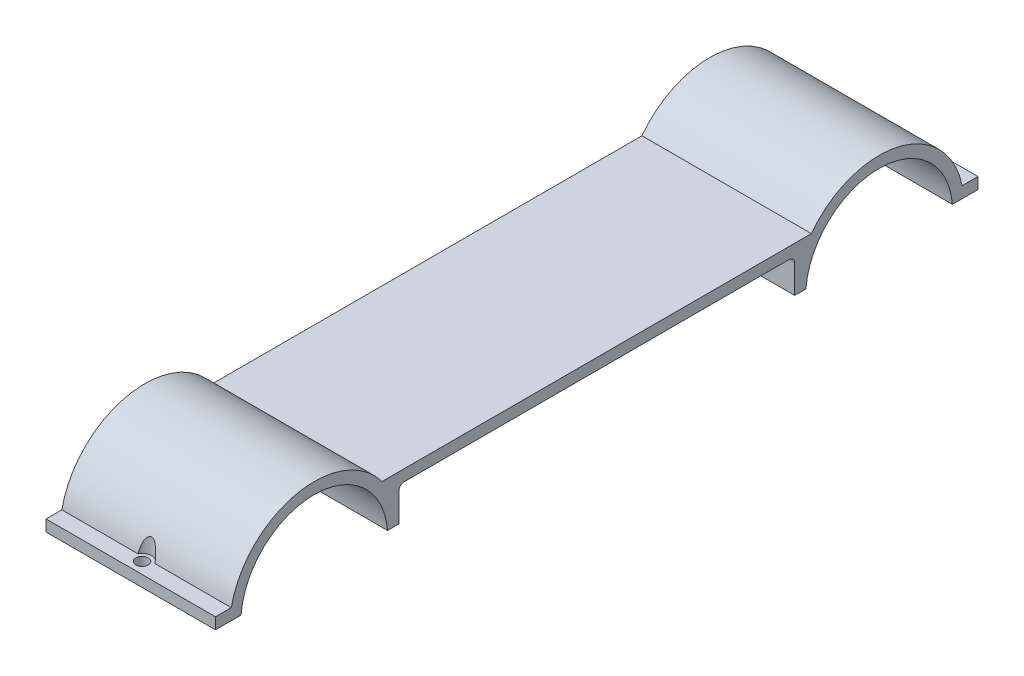
ISO-10303-21;
HEADER;
FILE_DESCRIPTION(('STEP AP214'),'2;1');
FILE_NAME('part.step','',(''),(''),'','','');
FILE_SCHEMA(('AUTOMOTIVE_DESIGN { 1 0 10303 214 1 1 1 1 }'));
ENDSEC;
DATA;
#1=APPLICATION_CONTEXT('core data for automotive mechanical design processes');
#2=APPLICATION_PROTOCOL_DEFINITION('international standard','automotive_design',2000,#1);
#3=PRODUCT_CONTEXT('',#1,'mechanical');
#4=PRODUCT('Part','Part','',(#3));
#5=PRODUCT_RELATED_PRODUCT_CATEGORY('part','',(#4));
#6=PRODUCT_DEFINITION_FORMATION('','',#4);
#7=PRODUCT_DEFINITION_CONTEXT('part definition',#1,'design');
#8=PRODUCT_DEFINITION('design','',#6,#7);
#9=PRODUCT_DEFINITION_SHAPE('','',#8);
#10=(LENGTH_UNIT() NAMED_UNIT(*) SI_UNIT(.MILLI.,.METRE.));
#11=(NAMED_UNIT(*) PLANE_ANGLE_UNIT() SI_UNIT($,.RADIAN.));
#12=(NAMED_UNIT(*) SI_UNIT($,.STERADIAN.) SOLID_ANGLE_UNIT());
#13=UNCERTAINTY_MEASURE_WITH_UNIT(LENGTH_MEASURE(1.E-05),#10,'distance_accuracy_value','');
#14=(GEOMETRIC_REPRESENTATION_CONTEXT(3) GLOBAL_UNCERTAINTY_ASSIGNED_CONTEXT((#13)) GLOBAL_UNIT_ASSIGNED_CONTEXT((#10,
#11,#12)) REPRESENTATION_CONTEXT('',''));
#15=CARTESIAN_POINT('',(0.,0.,0.));
#16=DIRECTION('',(0.,0.,1.));
#17=DIRECTION('',(1.,0.,0.));
#18=AXIS2_PLACEMENT_3D('',#15,#16,#17);
#19=CARTESIAN_POINT('',(0.,13.,65.5));
#20=DIRECTION('',(0.,-1.,0.));
#21=DIRECTION('',(0.,0.,-1.));
#22=AXIS2_PLACEMENT_3D('',#19,#20,#21);
#23=CYLINDRICAL_SURFACE('',#22,1.1);
#24=CARTESIAN_POINT('',(0.,1.,65.5));
#25=DIRECTION('',(0.,-1.,0.));
#26=DIRECTION('',(0.,0.,-1.));
#27=AXIS2_PLACEMENT_3D('',#24,#25,#26);
#28=CIRCLE('',#27,1.1);
#29=CARTESIAN_POINT('',(0.,1.,64.4));
#30=VERTEX_POINT('',#29);
#31=EDGE_CURVE('E251',#30,#30,#28,.T.);
#32=ORIENTED_EDGE('',*,*,#31,.T.);
#33=EDGE_LOOP('',(#32));
#34=FACE_BOUND('',#33,.T.);
#35=CARTESIAN_POINT('',(0.,3.,65.5));
#36=DIRECTION('',(0.,1.,0.));
#37=DIRECTION('',(0.,0.,1.));
#38=AXIS2_PLACEMENT_3D('',#35,#36,#37);
#39=CIRCLE('',#38,1.1);
#40=CARTESIAN_POINT('',(0.,3.,66.6));
#41=VERTEX_POINT('',#40);
#42=EDGE_CURVE('E182',#41,#41,#39,.T.);
#43=ORIENTED_EDGE('',*,*,#42,.T.);
#44=EDGE_LOOP('',(#43));
#45=FACE_BOUND('',#44,.T.);
#46=ADVANCED_FACE('F34',(#34,#45),#23,.F.);
#47=CARTESIAN_POINT('',(-15.,0.,-50.));
#48=DIRECTION('',(1.,0.,0.));
#49=DIRECTION('',(0.,0.,-1.));
#50=AXIS2_PLACEMENT_3D('',#47,#48,#49);
#51=CYLINDRICAL_SURFACE('',#50,15.);
#52=DIRECTION('',(1.,0.,0.));
#53=VECTOR('',#52,1.);
#54=CARTESIAN_POINT('',(-15.,3.,-64.6969384566991));
#55=LINE('',#54,#53);
#56=CARTESIAN_POINT('',(1.50230822978829,3.,-64.6969384566991));
#57=VERTEX_POINT('',#56);
#58=CARTESIAN_POINT('',(15.,3.,-64.6969384566991));
#59=VERTEX_POINT('',#58);
#60=EDGE_CURVE('E208',#57,#59,#55,.T.);
#61=ORIENTED_EDGE('',*,*,#60,.F.);
#62=CARTESIAN_POINT('',(1.50230822978829,3.,-64.6969384566991));
#63=CARTESIAN_POINT('',(1.49441524977783,3.07230826878945,-64.6821789263713));
#64=CARTESIAN_POINT('',(1.48597010649453,3.14444966021129,-64.6668968838992));
#65=CARTESIAN_POINT('',(1.4678122564595,3.28835782949057,-64.6353041904246));
#66=CARTESIAN_POINT('',(1.45809935762588,3.36012454886307,-64.6189933837446));
#67=CARTESIAN_POINT('',(1.42673710254049,3.57532298847141,-64.5684191074486));
#68=CARTESIAN_POINT('',(1.40292280764907,3.71809175494098,-64.5326284342373));
#69=CARTESIAN_POINT('',(1.34638294638917,4.00871839523123,-64.4552390538758));
#70=CARTESIAN_POINT('',(1.31325254895716,4.15644585233561,-64.4134332375339));
#71=CARTESIAN_POINT('',(1.2552497684036,4.37488941609096,-64.3480355504195));
#72=CARTESIAN_POINT('',(1.23454975620087,4.44712591238824,-64.3258059787792));
#73=CARTESIAN_POINT('',(1.18988630980696,4.59032699553897,-64.2805647267181));
#74=CARTESIAN_POINT('',(1.16592360868089,4.6612918640619,-64.257553222852));
#75=CARTESIAN_POINT('',(1.11447914804405,4.80068565684299,-64.211218832365));
#76=CARTESIAN_POINT('',(1.08704763016074,4.8691356285362,-64.1879039804165));
#77=CARTESIAN_POINT('',(1.02767511343183,5.00400883281599,-64.1408979434631));
#78=CARTESIAN_POINT('',(0.995730936493252,5.07043059657262,-64.117206503768));
#79=CARTESIAN_POINT('',(0.926862208694232,5.19958269844715,-64.0701457616122));
#80=CARTESIAN_POINT('',(0.890007086153132,5.26234955689761,-64.0467762393949));
#81=CARTESIAN_POINT('',(0.809903053884836,5.38384930316669,-64.0006559050933));
#82=CARTESIAN_POINT('',(0.766665289163742,5.4425889663593,-63.9779040947732));
#83=CARTESIAN_POINT('',(0.68751330203788,5.5361988907716,-63.9410245847031));
#84=CARTESIAN_POINT('',(0.653708403732269,5.57267530308649,-63.9264743553136));
#85=CARTESIAN_POINT('',(0.581939848093948,5.64198016303053,-63.8985414176691));
#86=CARTESIAN_POINT('',(0.543970043261055,5.67480307013952,-63.8851604890824));
#87=CARTESIAN_POINT('',(0.46312542529635,5.7356594150972,-63.8601336340771));
#88=CARTESIAN_POINT('',(0.420204782160252,5.76364091650378,-63.8485066750728));
#89=CARTESIAN_POINT('',(0.329810900316235,5.81238964329537,-63.8281173325732));
#90=CARTESIAN_POINT('',(0.282348516710686,5.83317354771031,-63.8193483291393));
#91=CARTESIAN_POINT('',(0.196386885070385,5.86121321489402,-63.8074744470459));
#92=CARTESIAN_POINT('',(0.15869781473951,5.87056900070877,-63.8034946802127));
#93=CARTESIAN_POINT('',(0.0821482988762569,5.88330188700302,-63.7980726520532));
#94=CARTESIAN_POINT('',(0.0432889398555377,5.8866843691199,-63.7966281066309));
#95=CARTESIAN_POINT('',(-0.0345321709547194,5.8871561274972,-63.7964268159485));
#96=CARTESIAN_POINT('',(-0.0734939895393714,5.8842362884384,-63.7976739638003));
#97=CARTESIAN_POINT('',(-0.150319983552076,5.87236807111262,-63.8027291849324));
#98=CARTESIAN_POINT('',(-0.188183233566926,5.86341475582596,-63.8065393554557));
#99=CARTESIAN_POINT('',(-0.270859749312626,5.83740568122667,-63.8175589831982));
#100=CARTESIAN_POINT('',(-0.315136805078055,5.81891324375313,-63.8253680233208));
#101=CARTESIAN_POINT('',(-0.399847293976827,5.77553908908261,-63.8435436846265));
#102=CARTESIAN_POINT('',(-0.440273803199391,5.75064614927853,-63.853914796868));
#103=CARTESIAN_POINT('',(-0.538021731776477,5.68131136465347,-63.8825338990737));
#104=CARTESIAN_POINT('',(-0.592629530626322,5.63358523001277,-63.9020051459564));
#105=CARTESIAN_POINT('',(-0.693573383992693,5.53096691634615,-63.943151982154));
#106=CARTESIAN_POINT('',(-0.739889663197306,5.47605813208176,-63.9648326528488));
#107=CARTESIAN_POINT('',(-0.823782990624103,5.36401416823422,-64.0082408100579));
#108=CARTESIAN_POINT('',(-0.861650076477517,5.30707608861665,-64.029926240318));
#109=CARTESIAN_POINT('',(-0.932178150246732,5.1901395602504,-64.0736049193533));
#110=CARTESIAN_POINT('',(-0.964834078811821,5.13013821115398,-64.0955984449895));
#111=CARTESIAN_POINT('',(-1.02596690741123,5.00755915899918,-64.139611704838));
#112=CARTESIAN_POINT('',(-1.05441642902552,4.94496770395425,-64.1616307446061));
#113=CARTESIAN_POINT('',(-1.10757475850939,4.81813782726541,-64.2052825591129));
#114=CARTESIAN_POINT('',(-1.13228512840196,4.75390010653301,-64.2269154917971));
#115=CARTESIAN_POINT('',(-1.20395933027463,4.55291416716918,-64.2930560181862));
#116=CARTESIAN_POINT('',(-1.24558841062118,4.41394784691443,-64.3366160649822));
#117=CARTESIAN_POINT('',(-1.31880056433652,4.13225969548034,-64.4203367793006));
#118=CARTESIAN_POINT('',(-1.35036729811974,3.98953215942812,-64.4604918408791));
#119=CARTESIAN_POINT('',(-1.40494666136727,3.70630924250879,-64.5356121957234));
#120=CARTESIAN_POINT('',(-1.42820619614735,3.56589451985671,-64.5707046277956));
#121=CARTESIAN_POINT('',(-1.45890507495766,3.35424721085885,-64.6203371980622));
#122=CARTESIAN_POINT('',(-1.46842703996775,3.28364756117311,-64.6363557961434));
#123=CARTESIAN_POINT('',(-1.4862468570742,3.14208626605045,-64.6673972874135));
#124=CARTESIAN_POINT('',(-1.49454488575389,3.07112467436406,-64.6824203240643));
#125=CARTESIAN_POINT('',(-1.50230822978912,3.00000000000029,-64.6969384566991));
#126=B_SPLINE_CURVE_WITH_KNOTS('',3,(#62,#63,#64,#65,#66,#67,#68,#69,#70,#71,#72,#73,#74,#75,
#76,#77,#78,#79,#80,#81,#82,#83,#84,#85,#86,#87,#88,#89,#90,#91,#92,#93,#94,#95,#96,#97,#98,#99,
#100,#101,#102,#103,#104,#105,#106,#107,#108,#109,#110,#111,#112,#113,#114,#115,#116,#117,#118,
#119,#120,#121,#122,#123,#124,#125),.UNSPECIFIED.,.F.,.F.,(4,2,2,2,2,2,2,2,2,2,2,2,2,2,2,2,2,2,
2,2,2,2,2,2,2,2,2,2,2,2,2,4),(0.,0.22265492449648,0.445343623431839,0.892446688988669,
1.36320619100767,1.59823087405359,1.83320283832482,2.06509498573274,2.29715126770036,
2.52621939480985,2.75489216665901,2.91010596589522,3.06555202819061,3.22257421056415,
3.37923005078358,3.49584083843432,3.61234651209974,3.72902080585295,3.84579068693203,
3.99082596454163,4.13611730134906,4.36012852430576,4.58466709664726,4.79955572608689,
5.01465173133431,5.23109133023361,5.44744026082362,5.90119244176981,6.35567773139295,
6.79523546828434,7.01427430369331,7.23328150631466),.UNSPECIFIED.);
#127=CARTESIAN_POINT('',(-1.50230822978829,3.,-64.6969384566991));
#128=VERTEX_POINT('',#127);
#129=EDGE_CURVE('E239',#57,#128,#126,.T.);
#130=ORIENTED_EDGE('',*,*,#129,.T.);
#131=CARTESIAN_POINT('',(-15.,3.,-64.6969384566991));
#132=VERTEX_POINT('',#131);
#133=EDGE_CURVE('E205',#132,#128,#55,.T.);
#134=ORIENTED_EDGE('',*,*,#133,.F.);
#135=CARTESIAN_POINT('',(-15.,0.,-50.));
#136=DIRECTION('',(1.,0.,0.));
#137=DIRECTION('',(0.,0.,-1.));
#138=AXIS2_PLACEMENT_3D('',#135,#136,#137);
#139=CIRCLE('',#138,15.);
#140=CARTESIAN_POINT('',(-15.,9.00000000000001,-38.));
#141=VERTEX_POINT('',#140);
#142=EDGE_CURVE('E379',#132,#141,#139,.T.);
#143=ORIENTED_EDGE('',*,*,#142,.T.);
#144=DIRECTION('',(1.,0.,0.));
#145=VECTOR('',#144,1.);
#146=CARTESIAN_POINT('',(-15.,9.00000000000001,-38.));
#147=LINE('',#146,#145);
#148=CARTESIAN_POINT('',(15.,9.00000000000001,-38.));
#149=VERTEX_POINT('',#148);
#150=EDGE_CURVE('E199',#141,#149,#147,.T.);
#151=ORIENTED_EDGE('',*,*,#150,.T.);
#152=CARTESIAN_POINT('',(15.,0.,-50.));
#153=DIRECTION('',(1.,0.,0.));
#154=DIRECTION('',(0.,0.,-1.));
#155=AXIS2_PLACEMENT_3D('',#152,#153,#154);
#156=CIRCLE('',#155,15.);
#157=EDGE_CURVE('E410',#59,#149,#156,.T.);
#158=ORIENTED_EDGE('',*,*,#157,.F.);
#159=EDGE_LOOP('',(#61,#130,#134,#143,#151,#158));
#160=FACE_BOUND('',#159,.T.);
#161=ADVANCED_FACE('F260',(#160),#51,.T.);
#162=CARTESIAN_POINT('',(0.,13.,-65.5));
#163=DIRECTION('',(0.,-1.,0.));
#164=DIRECTION('',(0.,0.,-1.));
#165=AXIS2_PLACEMENT_3D('',#162,#163,#164);
#166=CYLINDRICAL_SURFACE('',#165,1.1);
#167=CARTESIAN_POINT('',(0.,1.00000000000002,-65.5));
#168=DIRECTION('',(0.,-1.,0.));
#169=DIRECTION('',(0.,0.,-1.));
#170=AXIS2_PLACEMENT_3D('',#167,#168,#169);
#171=CIRCLE('',#170,1.1);
#172=CARTESIAN_POINT('',(0.,1.00000000000001,-66.6));
#173=VERTEX_POINT('',#172);
#174=EDGE_CURVE('E236',#173,#173,#171,.F.);
#175=ORIENTED_EDGE('',*,*,#174,.F.);
#176=EDGE_LOOP('',(#175));
#177=FACE_BOUND('',#176,.T.);
#178=CARTESIAN_POINT('',(0.,3.,-65.5));
#179=DIRECTION('',(0.,1.,0.));
#180=DIRECTION('',(0.,0.,1.));
#181=AXIS2_PLACEMENT_3D('',#178,#179,#180);
#182=CIRCLE('',#181,1.1);
#183=CARTESIAN_POINT('',(0.,3.,-64.4));
#184=VERTEX_POINT('',#183);
#185=EDGE_CURVE('E238',#184,#184,#182,.F.);
#186=ORIENTED_EDGE('',*,*,#185,.F.);
#187=EDGE_LOOP('',(#186));
#188=FACE_BOUND('',#187,.T.);
#189=ADVANCED_FACE('F270',(#177,#188),#166,.F.);
#190=CARTESIAN_POINT('',(-15.,3.,-64.6969384566991));
#191=DIRECTION('',(0.,1.,0.));
#192=DIRECTION('',(0.,0.,1.));
#193=AXIS2_PLACEMENT_3D('',#190,#191,#192);
#194=PLANE('',#193);
#195=ORIENTED_EDGE('',*,*,#185,.T.);
#196=EDGE_LOOP('',(#195));
#197=FACE_BOUND('',#196,.T.);
#198=ORIENTED_EDGE('',*,*,#133,.T.);
#199=CARTESIAN_POINT('',(0.,3.,-65.5));
#200=DIRECTION('',(0.,1.,0.));
#201=DIRECTION('',(0.,0.,1.));
#202=AXIS2_PLACEMENT_3D('',#199,#200,#201);
#203=CIRCLE('',#202,1.70347816528962);
#204=EDGE_CURVE('E246',#128,#57,#203,.T.);
#205=ORIENTED_EDGE('',*,*,#204,.T.);
#206=ORIENTED_EDGE('',*,*,#60,.T.);
#207=DIRECTION('',(0.,0.,1.));
#208=VECTOR('',#207,1.);
#209=CARTESIAN_POINT('',(15.,3.,-64.6969384566991));
#210=LINE('',#209,#208);
#211=CARTESIAN_POINT('',(15.,3.,-67.5));
#212=VERTEX_POINT('',#211);
#213=EDGE_CURVE('E413',#212,#59,#210,.T.);
#214=ORIENTED_EDGE('',*,*,#213,.F.);
#215=DIRECTION('',(1.,0.,0.));
#216=VECTOR('',#215,1.);
#217=CARTESIAN_POINT('',(-15.,3.,-67.5));
#218=LINE('',#217,#216);
#219=CARTESIAN_POINT('',(-15.,3.,-67.5));
#220=VERTEX_POINT('',#219);
#221=EDGE_CURVE('E209',#220,#212,#218,.T.);
#222=ORIENTED_EDGE('',*,*,#221,.F.);
#223=DIRECTION('',(0.,0.,1.));
#224=VECTOR('',#223,1.);
#225=CARTESIAN_POINT('',(-15.,3.,-64.6969384566991));
#226=LINE('',#225,#224);
#227=EDGE_CURVE('E376',#220,#132,#226,.T.);
#228=ORIENTED_EDGE('',*,*,#227,.T.);
#229=EDGE_LOOP('',(#198,#205,#206,#214,#222,#228));
#230=FACE_BOUND('',#229,.T.);
#231=ADVANCED_FACE('F273',(#197,#230),#194,.T.);
#232=CARTESIAN_POINT('',(-15.,1.00000000000005,-62.9614813968157));
#233=DIRECTION('',(0.,-1.,0.));
#234=DIRECTION('',(0.,0.,-1.));
#235=AXIS2_PLACEMENT_3D('',#232,#233,#234);
#236=PLANE('',#235);
#237=DIRECTION('',(1.,0.,0.));
#238=VECTOR('',#237,1.);
#239=CARTESIAN_POINT('',(-15.,1.,-67.5));
#240=LINE('',#239,#238);
#241=CARTESIAN_POINT('',(-15.,1.,-67.5));
#242=VERTEX_POINT('',#241);
#243=CARTESIAN_POINT('',(15.,1.,-67.5));
#244=VERTEX_POINT('',#243);
#245=EDGE_CURVE('E211',#242,#244,#240,.T.);
#246=ORIENTED_EDGE('',*,*,#245,.T.);
#247=DIRECTION('',(0.,0.,-1.));
#248=VECTOR('',#247,1.);
#249=CARTESIAN_POINT('',(15.,1.00000000000005,-62.9614813968157));
#250=LINE('',#249,#248);
#251=CARTESIAN_POINT('',(15.,1.00000000000005,-62.9614813968157));
#252=VERTEX_POINT('',#251);
#253=EDGE_CURVE('E419',#252,#244,#250,.T.);
#254=ORIENTED_EDGE('',*,*,#253,.F.);
#255=DIRECTION('',(1.,0.,0.));
#256=VECTOR('',#255,1.);
#257=CARTESIAN_POINT('',(-15.,1.00000000000005,-62.9614813968157));
#258=LINE('',#257,#256);
#259=CARTESIAN_POINT('',(-15.,1.00000000000005,-62.9614813968157));
#260=VERTEX_POINT('',#259);
#261=EDGE_CURVE('E213',#260,#252,#258,.T.);
#262=ORIENTED_EDGE('',*,*,#261,.F.);
#263=DIRECTION('',(0.,0.,-1.));
#264=VECTOR('',#263,1.);
#265=CARTESIAN_POINT('',(-15.,1.00000000000005,-62.9614813968157));
#266=LINE('',#265,#264);
#267=EDGE_CURVE('E370',#260,#242,#266,.T.);
#268=ORIENTED_EDGE('',*,*,#267,.T.);
#269=EDGE_LOOP('',(#246,#254,#262,#268));
#270=FACE_BOUND('',#269,.T.);
#271=ORIENTED_EDGE('',*,*,#174,.T.);
#272=EDGE_LOOP('',(#271));
#273=FACE_BOUND('',#272,.T.);
#274=ADVANCED_FACE('F452',(#270,#273),#236,.T.);
#275=CARTESIAN_POINT('',(-15.,7.,35.0385186031843));
#276=DIRECTION('',(0.,-1.,0.));
#277=DIRECTION('',(0.,0.,-1.));
#278=AXIS2_PLACEMENT_3D('',#275,#276,#277);
#279=PLANE('',#278);
#280=DIRECTION('',(0.,0.,-1.));
#281=VECTOR('',#280,1.);
#282=CARTESIAN_POINT('',(-15.,7.,35.0385186031843));
#283=LINE('',#282,#281);
#284=CARTESIAN_POINT('',(-15.,7.,34.0385186031843));
#285=VERTEX_POINT('',#284);
#286=CARTESIAN_POINT('',(-15.,7.,-34.0385186031843));
#287=VERTEX_POINT('',#286);
#288=EDGE_CURVE('E359',#285,#287,#283,.T.);
#289=ORIENTED_EDGE('',*,*,#288,.T.);
#290=DIRECTION('',(1.,0.,0.));
#291=VECTOR('',#290,1.);
#292=CARTESIAN_POINT('',(15.,7.,-34.0385186031843));
#293=LINE('',#292,#291);
#294=CARTESIAN_POINT('',(15.,7.,-34.0385186031843));
#295=VERTEX_POINT('',#294);
#296=EDGE_CURVE('E223',#287,#295,#293,.T.);
#297=ORIENTED_EDGE('',*,*,#296,.T.);
#298=DIRECTION('',(0.,0.,-1.));
#299=VECTOR('',#298,1.);
#300=CARTESIAN_POINT('',(15.,7.,35.0385186031843));
#301=LINE('',#300,#299);
#302=CARTESIAN_POINT('',(15.,7.,34.0385186031843));
#303=VERTEX_POINT('',#302);
#304=EDGE_CURVE('E243',#303,#295,#301,.T.);
#305=ORIENTED_EDGE('',*,*,#304,.F.);
#306=DIRECTION('',(1.,0.,0.));
#307=VECTOR('',#306,1.);
#308=CARTESIAN_POINT('',(-15.,7.,34.0385186031843));
#309=LINE('',#308,#307);
#310=EDGE_CURVE('E221',#303,#285,#309,.F.);
#311=ORIENTED_EDGE('',*,*,#310,.T.);
#312=EDGE_LOOP('',(#289,#297,#305,#311));
#313=FACE_BOUND('',#312,.T.);
#314=ADVANCED_FACE('F288',(#313),#279,.T.);
#315=CARTESIAN_POINT('',(-15.,7.,35.0385186031843));
#316=DIRECTION('',(0.,0.,-1.));
#317=DIRECTION('',(-1.,0.,0.));
#318=AXIS2_PLACEMENT_3D('',#315,#316,#317);
#319=PLANE('',#318);
#320=DIRECTION('',(0.,1.,0.));
#321=VECTOR('',#320,1.);
#322=CARTESIAN_POINT('',(-15.,7.,35.0385186031843));
#323=LINE('',#322,#321);
#324=CARTESIAN_POINT('',(-15.,1.,35.0385186031843));
#325=VERTEX_POINT('',#324);
#326=CARTESIAN_POINT('',(-15.,6.,35.0385186031843));
#327=VERTEX_POINT('',#326);
#328=EDGE_CURVE('E220',#325,#327,#323,.T.);
#329=ORIENTED_EDGE('',*,*,#328,.T.);
#330=DIRECTION('',(1.,0.,0.));
#331=VECTOR('',#330,1.);
#332=CARTESIAN_POINT('',(15.,6.,35.0385186031843));
#333=LINE('',#332,#331);
#334=CARTESIAN_POINT('',(15.,6.,35.0385186031843));
#335=VERTEX_POINT('',#334);
#336=EDGE_CURVE('E229',#327,#335,#333,.T.);
#337=ORIENTED_EDGE('',*,*,#336,.T.);
#338=DIRECTION('',(0.,1.,0.));
#339=VECTOR('',#338,1.);
#340=CARTESIAN_POINT('',(15.,7.,35.0385186031843));
#341=LINE('',#340,#339);
#342=CARTESIAN_POINT('',(15.,1.,35.0385186031843));
#343=VERTEX_POINT('',#342);
#344=EDGE_CURVE('E354',#343,#335,#341,.T.);
#345=ORIENTED_EDGE('',*,*,#344,.F.);
#346=DIRECTION('',(1.,0.,0.));
#347=VECTOR('',#346,1.);
#348=CARTESIAN_POINT('',(-15.,1.,35.0385186031843));
#349=LINE('',#348,#347);
#350=EDGE_CURVE('E224',#325,#343,#349,.T.);
#351=ORIENTED_EDGE('',*,*,#350,.F.);
#352=EDGE_LOOP('',(#329,#337,#345,#351));
#353=FACE_BOUND('',#352,.T.);
#354=ADVANCED_FACE('F284',(#353),#319,.T.);
#355=CARTESIAN_POINT('',(-15.,1.,35.0385186031843));
#356=DIRECTION('',(0.,-1.,0.));
#357=DIRECTION('',(0.,0.,-1.));
#358=AXIS2_PLACEMENT_3D('',#355,#356,#357);
#359=PLANE('',#358);
#360=ORIENTED_EDGE('',*,*,#350,.T.);
#361=DIRECTION('',(0.,0.,-1.));
#362=VECTOR('',#361,1.);
#363=CARTESIAN_POINT('',(15.,1.,35.0385186031843));
#364=LINE('',#363,#362);
#365=CARTESIAN_POINT('',(15.,1.,37.0385186031843));
#366=VERTEX_POINT('',#365);
#367=EDGE_CURVE('E352',#366,#343,#364,.T.);
#368=ORIENTED_EDGE('',*,*,#367,.F.);
#369=DIRECTION('',(1.,0.,0.));
#370=VECTOR('',#369,1.);
#371=CARTESIAN_POINT('',(-15.,1.,37.0385186031843));
#372=LINE('',#371,#370);
#373=CARTESIAN_POINT('',(-15.,1.,37.0385186031843));
#374=VERTEX_POINT('',#373);
#375=EDGE_CURVE('E340',#374,#366,#372,.T.);
#376=ORIENTED_EDGE('',*,*,#375,.F.);
#377=DIRECTION('',(0.,0.,-1.));
#378=VECTOR('',#377,1.);
#379=CARTESIAN_POINT('',(-15.,1.,35.0385186031843));
#380=LINE('',#379,#378);
#381=EDGE_CURVE('E396',#374,#325,#380,.T.);
#382=ORIENTED_EDGE('',*,*,#381,.T.);
#383=EDGE_LOOP('',(#360,#368,#376,#382));
#384=FACE_BOUND('',#383,.T.);
#385=ADVANCED_FACE('F287',(#384),#359,.T.);
#386=CARTESIAN_POINT('',(-15.,0.,50.));
#387=DIRECTION('',(1.,0.,0.));
#388=DIRECTION('',(0.,0.,-1.));
#389=AXIS2_PLACEMENT_3D('',#386,#387,#388);
#390=CYLINDRICAL_SURFACE('',#389,13.);
#391=ORIENTED_EDGE('',*,*,#375,.T.);
#392=CARTESIAN_POINT('',(15.,0.,50.));
#393=DIRECTION('',(-1.,0.,0.));
#394=DIRECTION('',(0.,0.,1.));
#395=AXIS2_PLACEMENT_3D('',#392,#393,#394);
#396=CIRCLE('',#395,13.);
#397=CARTESIAN_POINT('',(15.,1.,62.9614813968157));
#398=VERTEX_POINT('',#397);
#399=EDGE_CURVE('E347',#398,#366,#396,.T.);
#400=ORIENTED_EDGE('',*,*,#399,.F.);
#401=DIRECTION('',(1.,0.,0.));
#402=VECTOR('',#401,1.);
#403=CARTESIAN_POINT('',(-15.,1.,62.9614813968157));
#404=LINE('',#403,#402);
#405=CARTESIAN_POINT('',(-15.,1.,62.9614813968157));
#406=VERTEX_POINT('',#405);
#407=EDGE_CURVE('E332',#406,#398,#404,.T.);
#408=ORIENTED_EDGE('',*,*,#407,.F.);
#409=CARTESIAN_POINT('',(-15.,0.,50.));
#410=DIRECTION('',(-1.,0.,0.));
#411=DIRECTION('',(0.,0.,1.));
#412=AXIS2_PLACEMENT_3D('',#409,#410,#411);
#413=CIRCLE('',#412,13.);
#414=EDGE_CURVE('E394',#406,#374,#413,.T.);
#415=ORIENTED_EDGE('',*,*,#414,.T.);
#416=EDGE_LOOP('',(#391,#400,#408,#415));
#417=FACE_BOUND('',#416,.T.);
#418=ADVANCED_FACE('F292',(#417),#390,.F.);
#419=CARTESIAN_POINT('',(-15.,1.,67.5));
#420=DIRECTION('',(0.,-1.,0.));
#421=DIRECTION('',(0.,0.,-1.));
#422=AXIS2_PLACEMENT_3D('',#419,#420,#421);
#423=PLANE('',#422);
#424=ORIENTED_EDGE('',*,*,#31,.F.);
#425=EDGE_LOOP('',(#424));
#426=FACE_BOUND('',#425,.T.);
#427=ORIENTED_EDGE('',*,*,#407,.T.);
#428=DIRECTION('',(0.,0.,-1.));
#429=VECTOR('',#428,1.);
#430=CARTESIAN_POINT('',(15.,1.,67.5));
#431=LINE('',#430,#429);
#432=CARTESIAN_POINT('',(15.,1.,67.5));
#433=VERTEX_POINT('',#432);
#434=EDGE_CURVE('E334',#433,#398,#431,.T.);
#435=ORIENTED_EDGE('',*,*,#434,.F.);
#436=DIRECTION('',(1.,0.,0.));
#437=VECTOR('',#436,1.);
#438=CARTESIAN_POINT('',(-15.,1.,67.5));
#439=LINE('',#438,#437);
#440=CARTESIAN_POINT('',(-15.,1.,67.5));
#441=VERTEX_POINT('',#440);
#442=EDGE_CURVE('E341',#441,#433,#439,.T.);
#443=ORIENTED_EDGE('',*,*,#442,.F.);
#444=DIRECTION('',(0.,0.,-1.));
#445=VECTOR('',#444,1.);
#446=CARTESIAN_POINT('',(-15.,1.,67.5));
#447=LINE('',#446,#445);
#448=EDGE_CURVE('E336',#441,#406,#447,.T.);
#449=ORIENTED_EDGE('',*,*,#448,.T.);
#450=EDGE_LOOP('',(#427,#435,#443,#449));
#451=FACE_BOUND('',#450,.T.);
#452=ADVANCED_FACE('F296',(#426,#451),#423,.T.);
#453=CARTESIAN_POINT('',(-15.,3.,67.5));
#454=DIRECTION('',(0.,0.,1.));
#455=DIRECTION('',(1.,0.,0.));
#456=AXIS2_PLACEMENT_3D('',#453,#454,#455);
#457=PLANE('',#456);
#458=ORIENTED_EDGE('',*,*,#442,.T.);
#459=DIRECTION('',(0.,-1.,0.));
#460=VECTOR('',#459,1.);
#461=CARTESIAN_POINT('',(15.,3.,67.5));
#462=LINE('',#461,#460);
#463=CARTESIAN_POINT('',(15.,3.,67.5));
#464=VERTEX_POINT('',#463);
#465=EDGE_CURVE('E350',#464,#433,#462,.T.);
#466=ORIENTED_EDGE('',*,*,#465,.F.);
#467=DIRECTION('',(1.,0.,0.));
#468=VECTOR('',#467,1.);
#469=CARTESIAN_POINT('',(-15.,3.,67.5));
#470=LINE('',#469,#468);
#471=CARTESIAN_POINT('',(-15.,3.,67.5));
#472=VERTEX_POINT('',#471);
#473=EDGE_CURVE('E198',#472,#464,#470,.T.);
#474=ORIENTED_EDGE('',*,*,#473,.F.);
#475=DIRECTION('',(0.,-1.,0.));
#476=VECTOR('',#475,1.);
#477=CARTESIAN_POINT('',(-15.,3.,67.5));
#478=LINE('',#477,#476);
#479=EDGE_CURVE('E390',#472,#441,#478,.T.);
#480=ORIENTED_EDGE('',*,*,#479,.T.);
#481=EDGE_LOOP('',(#458,#466,#474,#480));
#482=FACE_BOUND('',#481,.T.);
#483=ADVANCED_FACE('F300',(#482),#457,.T.);
#484=CARTESIAN_POINT('',(-15.,3.,67.5));
#485=DIRECTION('',(0.,1.,0.));
#486=DIRECTION('',(0.,0.,1.));
#487=AXIS2_PLACEMENT_3D('',#484,#485,#486);
#488=PLANE('',#487);
#489=DIRECTION('',(1.,0.,0.));
#490=VECTOR('',#489,1.);
#491=CARTESIAN_POINT('',(-15.,3.,64.6969384566991));
#492=LINE('',#491,#490);
#493=CARTESIAN_POINT('',(1.50230822978829,3.,64.6969384566991));
#494=VERTEX_POINT('',#493);
#495=CARTESIAN_POINT('',(15.,3.,64.6969384566991));
#496=VERTEX_POINT('',#495);
#497=EDGE_CURVE('E187',#494,#496,#492,.T.);
#498=ORIENTED_EDGE('',*,*,#497,.F.);
#499=CARTESIAN_POINT('',(0.,3.,65.5));
#500=DIRECTION('',(0.,-1.,0.));
#501=DIRECTION('',(0.,0.,-1.));
#502=AXIS2_PLACEMENT_3D('',#499,#500,#501);
#503=CIRCLE('',#502,1.70347816528962);
#504=CARTESIAN_POINT('',(-1.50230822978829,3.,64.6969384566991));
#505=VERTEX_POINT('',#504);
#506=EDGE_CURVE('E176',#505,#494,#503,.T.);
#507=ORIENTED_EDGE('',*,*,#506,.F.);
#508=CARTESIAN_POINT('',(-15.,3.,64.6969384566991));
#509=VERTEX_POINT('',#508);
#510=EDGE_CURVE('E190',#509,#505,#492,.T.);
#511=ORIENTED_EDGE('',*,*,#510,.F.);
#512=DIRECTION('',(0.,0.,1.));
#513=VECTOR('',#512,1.);
#514=CARTESIAN_POINT('',(-15.,3.,67.5));
#515=LINE('',#514,#513);
#516=EDGE_CURVE('E387',#509,#472,#515,.T.);
#517=ORIENTED_EDGE('',*,*,#516,.T.);
#518=ORIENTED_EDGE('',*,*,#473,.T.);
#519=DIRECTION('',(0.,0.,1.));
#520=VECTOR('',#519,1.);
#521=CARTESIAN_POINT('',(15.,3.,67.5));
#522=LINE('',#521,#520);
#523=EDGE_CURVE('E195',#496,#464,#522,.T.);
#524=ORIENTED_EDGE('',*,*,#523,.F.);
#525=EDGE_LOOP('',(#498,#507,#511,#517,#518,#524));
#526=FACE_BOUND('',#525,.T.);
#527=ORIENTED_EDGE('',*,*,#42,.F.);
#528=EDGE_LOOP('',(#527));
#529=FACE_BOUND('',#528,.T.);
#530=ADVANCED_FACE('F192',(#526,#529),#488,.T.);
#531=CARTESIAN_POINT('',(-15.,0.,50.));
#532=DIRECTION('',(1.,0.,0.));
#533=DIRECTION('',(0.,0.,-1.));
#534=AXIS2_PLACEMENT_3D('',#531,#532,#533);
#535=CYLINDRICAL_SURFACE('',#534,15.);
#536=CARTESIAN_POINT('',(1.50230822978829,3.,64.6969384566991));
#537=CARTESIAN_POINT('',(1.49441524977783,3.07230826878945,64.6821789263713));
#538=CARTESIAN_POINT('',(1.48597010649453,3.14444966021129,64.6668968838992));
#539=CARTESIAN_POINT('',(1.4678122564595,3.28835782949057,64.6353041904246));
#540=CARTESIAN_POINT('',(1.45809935762588,3.36012454886307,64.6189933837446));
#541=CARTESIAN_POINT('',(1.42673710254049,3.57532298847141,64.5684191074486));
#542=CARTESIAN_POINT('',(1.40292280764907,3.71809175494098,64.5326284342373));
#543=CARTESIAN_POINT('',(1.34638294638917,4.00871839523124,64.4552390538758));
#544=CARTESIAN_POINT('',(1.31325254895716,4.15644585233561,64.4134332375339));
#545=CARTESIAN_POINT('',(1.2552497684036,4.37488941609096,64.3480355504195));
#546=CARTESIAN_POINT('',(1.23454975620087,4.44712591238824,64.3258059787792));
#547=CARTESIAN_POINT('',(1.18988630980696,4.59032699553897,64.2805647267181));
#548=CARTESIAN_POINT('',(1.16592360868089,4.66129186406189,64.257553222852));
#549=CARTESIAN_POINT('',(1.11447914804406,4.80068565684299,64.211218832365));
#550=CARTESIAN_POINT('',(1.08704763016075,4.8691356285362,64.1879039804165));
#551=CARTESIAN_POINT('',(1.02767511343184,5.00400883281599,64.1408979434631));
#552=CARTESIAN_POINT('',(0.995730936493254,5.07043059657261,64.117206503768));
#553=CARTESIAN_POINT('',(0.926862208694235,5.19958269844715,64.0701457616122));
#554=CARTESIAN_POINT('',(0.890007086153135,5.26234955689761,64.0467762393949));
#555=CARTESIAN_POINT('',(0.80990305388484,5.38384930316669,64.0006559050933));
#556=CARTESIAN_POINT('',(0.766665289163746,5.4425889663593,63.9779040947732));
#557=CARTESIAN_POINT('',(0.687513302037882,5.5361988907716,63.9410245847031));
#558=CARTESIAN_POINT('',(0.653708403732269,5.57267530308648,63.9264743553136));
#559=CARTESIAN_POINT('',(0.581939848093949,5.64198016303053,63.8985414176691));
#560=CARTESIAN_POINT('',(0.543970043261059,5.67480307013952,63.8851604890824));
#561=CARTESIAN_POINT('',(0.463125425296355,5.7356594150972,63.8601336340771));
#562=CARTESIAN_POINT('',(0.420204782160257,5.76364091650378,63.8485066750728));
#563=CARTESIAN_POINT('',(0.329810900316238,5.81238964329537,63.8281173325732));
#564=CARTESIAN_POINT('',(0.282348516710688,5.83317354771031,63.8193483291393));
#565=CARTESIAN_POINT('',(0.196386885070387,5.86121321489401,63.8074744470459));
#566=CARTESIAN_POINT('',(0.158697814739512,5.87056900070877,63.8034946802127));
#567=CARTESIAN_POINT('',(0.0821482988762592,5.88330188700301,63.7980726520532));
#568=CARTESIAN_POINT('',(0.0432889398555402,5.8866843691199,63.7966281066309));
#569=CARTESIAN_POINT('',(-0.0345321709547173,5.8871561274972,63.7964268159485));
#570=CARTESIAN_POINT('',(-0.0734939895393697,5.8842362884384,63.7976739638003));
#571=CARTESIAN_POINT('',(-0.150319983552075,5.87236807111262,63.8027291849324));
#572=CARTESIAN_POINT('',(-0.188183233566925,5.86341475582596,63.8065393554557));
#573=CARTESIAN_POINT('',(-0.270859749312624,5.83740568122667,63.8175589831982));
#574=CARTESIAN_POINT('',(-0.315136805078051,5.81891324375313,63.8253680233208));
#575=CARTESIAN_POINT('',(-0.399847293976823,5.77553908908261,63.8435436846265));
#576=CARTESIAN_POINT('',(-0.440273803199387,5.75064614927853,63.853914796868));
#577=CARTESIAN_POINT('',(-0.538021731776471,5.68131136465346,63.8825338990737));
#578=CARTESIAN_POINT('',(-0.592629530626314,5.63358523001278,63.9020051459564));
#579=CARTESIAN_POINT('',(-0.693573383992683,5.53096691634616,63.943151982154));
#580=CARTESIAN_POINT('',(-0.739889663197297,5.47605813208176,63.9648326528488));
#581=CARTESIAN_POINT('',(-0.823782990624094,5.36401416823423,64.0082408100579));
#582=CARTESIAN_POINT('',(-0.861650076477507,5.30707608861666,64.029926240318));
#583=CARTESIAN_POINT('',(-0.93217815024672,5.19013956025042,64.0736049193533));
#584=CARTESIAN_POINT('',(-0.964834078811809,5.13013821115401,64.0955984449895));
#585=CARTESIAN_POINT('',(-1.02596690741122,5.0075591589992,64.139611704838));
#586=CARTESIAN_POINT('',(-1.05441642902551,4.94496770395427,64.1616307446061));
#587=CARTESIAN_POINT('',(-1.10757475850938,4.81813782726544,64.2052825591129));
#588=CARTESIAN_POINT('',(-1.13228512840195,4.75390010653304,64.2269154917971));
#589=CARTESIAN_POINT('',(-1.20395933027463,4.55291416716921,64.2930560181862));
#590=CARTESIAN_POINT('',(-1.24558841062117,4.41394784691446,64.3366160649822));
#591=CARTESIAN_POINT('',(-1.31880056433651,4.13225969548036,64.4203367793006));
#592=CARTESIAN_POINT('',(-1.35036729811974,3.98953215942814,64.4604918408791));
#593=CARTESIAN_POINT('',(-1.40494666136727,3.70630924250881,64.5356121957234));
#594=CARTESIAN_POINT('',(-1.42820619614735,3.56589451985673,64.5707046277956));
#595=CARTESIAN_POINT('',(-1.45890507495765,3.35424721085887,64.6203371980622));
#596=CARTESIAN_POINT('',(-1.46842703996775,3.28364756117312,64.6363557961434));
#597=CARTESIAN_POINT('',(-1.4862468570742,3.14208626605045,64.6673972874135));
#598=CARTESIAN_POINT('',(-1.49454488575389,3.07112467436406,64.6824203240643));
#599=CARTESIAN_POINT('',(-1.50230822978912,3.00000000000029,64.6969384566991));
#600=B_SPLINE_CURVE_WITH_KNOTS('',3,(#536,#537,#538,#539,#540,#541,#542,#543,#544,#545,#546,
#547,#548,#549,#550,#551,#552,#553,#554,#555,#556,#557,#558,#559,#560,#561,#562,#563,#564,#565,
#566,#567,#568,#569,#570,#571,#572,#573,#574,#575,#576,#577,#578,#579,#580,#581,#582,#583,#584,
#585,#586,#587,#588,#589,#590,#591,#592,#593,#594,#595,#596,#597,#598,#599),.UNSPECIFIED.,.F.,
.F.,(4,2,2,2,2,2,2,2,2,2,2,2,2,2,2,2,2,2,2,2,2,2,2,2,2,2,2,2,2,2,2,4),(0.,0.22265492449648,
0.445343623431841,0.892446688988672,1.36320619100767,1.59823087405359,1.83320283832482,
2.06509498573274,2.29715126770036,2.52621939480985,2.75489216665901,2.91010596589522,
3.06555202819061,3.22257421056415,3.37923005078357,3.49584083843432,3.61234651209974,
3.72902080585295,3.84579068693203,3.99082596454163,4.13611730134906,4.36012852430575,
4.58466709664724,4.79955572608687,5.01465173133429,5.23109133023357,5.44744026082358,
5.90119244176978,6.35567773139293,6.79523546828433,7.0142743036933,7.23328150631466),.UNSPECIFIED.);
#601=EDGE_CURVE('E11',#494,#505,#600,.T.);
#602=ORIENTED_EDGE('',*,*,#601,.F.);
#603=ORIENTED_EDGE('',*,*,#497,.T.);
#604=CARTESIAN_POINT('',(15.,0.,50.));
#605=DIRECTION('',(1.,0.,0.));
#606=DIRECTION('',(0.,0.,1.));
#607=AXIS2_PLACEMENT_3D('',#604,#605,#606);
#608=CIRCLE('',#607,15.);
#609=CARTESIAN_POINT('',(15.,9.00000000000001,38.));
#610=VERTEX_POINT('',#609);
#611=EDGE_CURVE('E404',#610,#496,#608,.T.);
#612=ORIENTED_EDGE('',*,*,#611,.F.);
#613=DIRECTION('',(1.,0.,0.));
#614=VECTOR('',#613,1.);
#615=CARTESIAN_POINT('',(-15.,9.00000000000001,38.));
#616=LINE('',#615,#614);
#617=CARTESIAN_POINT('',(-15.,9.00000000000001,38.));
#618=VERTEX_POINT('',#617);
#619=EDGE_CURVE('E196',#618,#610,#616,.T.);
#620=ORIENTED_EDGE('',*,*,#619,.F.);
#621=CARTESIAN_POINT('',(-15.,0.,50.));
#622=DIRECTION('',(1.,0.,0.));
#623=DIRECTION('',(0.,0.,1.));
#624=AXIS2_PLACEMENT_3D('',#621,#622,#623);
#625=CIRCLE('',#624,15.);
#626=EDGE_CURVE('E385',#618,#509,#625,.T.);
#627=ORIENTED_EDGE('',*,*,#626,.T.);
#628=ORIENTED_EDGE('',*,*,#510,.T.);
#629=EDGE_LOOP('',(#602,#603,#612,#620,#627,#628));
#630=FACE_BOUND('',#629,.T.);
#631=ADVANCED_FACE('F185',(#630),#535,.T.);
#632=CARTESIAN_POINT('',(-15.,9.00000000000001,38.));
#633=DIRECTION('',(0.,1.,0.));
#634=DIRECTION('',(0.,0.,1.));
#635=AXIS2_PLACEMENT_3D('',#632,#633,#634);
#636=PLANE('',#635);
#637=ORIENTED_EDGE('',*,*,#619,.T.);
#638=DIRECTION('',(0.,0.,1.));
#639=VECTOR('',#638,1.);
#640=CARTESIAN_POINT('',(15.,9.00000000000001,38.));
#641=LINE('',#640,#639);
#642=EDGE_CURVE('E408',#149,#610,#641,.T.);
#643=ORIENTED_EDGE('',*,*,#642,.F.);
#644=ORIENTED_EDGE('',*,*,#150,.F.);
#645=DIRECTION('',(0.,0.,1.));
#646=VECTOR('',#645,1.);
#647=CARTESIAN_POINT('',(-15.,9.00000000000001,38.));
#648=LINE('',#647,#646);
#649=EDGE_CURVE('E382',#141,#618,#648,.T.);
#650=ORIENTED_EDGE('',*,*,#649,.T.);
#651=EDGE_LOOP('',(#637,#643,#644,#650));
#652=FACE_BOUND('',#651,.T.);
#653=ADVANCED_FACE('F308',(#652),#636,.T.);
#654=CARTESIAN_POINT('',(-15.,1.,-67.5));
#655=DIRECTION('',(0.,0.,-1.));
#656=DIRECTION('',(-1.,0.,0.));
#657=AXIS2_PLACEMENT_3D('',#654,#655,#656);
#658=PLANE('',#657);
#659=ORIENTED_EDGE('',*,*,#221,.T.);
#660=DIRECTION('',(0.,1.,0.));
#661=VECTOR('',#660,1.);
#662=CARTESIAN_POINT('',(15.,1.,-67.5));
#663=LINE('',#662,#661);
#664=EDGE_CURVE('E416',#244,#212,#663,.T.);
#665=ORIENTED_EDGE('',*,*,#664,.F.);
#666=ORIENTED_EDGE('',*,*,#245,.F.);
#667=DIRECTION('',(0.,1.,0.));
#668=VECTOR('',#667,1.);
#669=CARTESIAN_POINT('',(-15.,1.,-67.5));
#670=LINE('',#669,#668);
#671=EDGE_CURVE('E373',#242,#220,#670,.T.);
#672=ORIENTED_EDGE('',*,*,#671,.T.);
#673=EDGE_LOOP('',(#659,#665,#666,#672));
#674=FACE_BOUND('',#673,.T.);
#675=ADVANCED_FACE('F310',(#674),#658,.T.);
#676=CARTESIAN_POINT('',(-15.,0.,-50.));
#677=DIRECTION('',(1.,0.,0.));
#678=DIRECTION('',(0.,0.,-1.));
#679=AXIS2_PLACEMENT_3D('',#676,#677,#678);
#680=CYLINDRICAL_SURFACE('',#679,13.);
#681=ORIENTED_EDGE('',*,*,#261,.T.);
#682=CARTESIAN_POINT('',(15.,0.,-50.));
#683=DIRECTION('',(-1.,0.,0.));
#684=DIRECTION('',(0.,0.,-1.));
#685=AXIS2_PLACEMENT_3D('',#682,#683,#684);
#686=CIRCLE('',#685,13.);
#687=CARTESIAN_POINT('',(15.,1.00000000000005,-37.0385186031843));
#688=VERTEX_POINT('',#687);
#689=EDGE_CURVE('E422',#688,#252,#686,.T.);
#690=ORIENTED_EDGE('',*,*,#689,.F.);
#691=DIRECTION('',(1.,0.,0.));
#692=VECTOR('',#691,1.);
#693=CARTESIAN_POINT('',(-15.,1.00000000000005,-37.0385186031843));
#694=LINE('',#693,#692);
#695=CARTESIAN_POINT('',(-15.,1.00000000000005,-37.0385186031843));
#696=VERTEX_POINT('',#695);
#697=EDGE_CURVE('E215',#696,#688,#694,.T.);
#698=ORIENTED_EDGE('',*,*,#697,.F.);
#699=CARTESIAN_POINT('',(-15.,0.,-50.));
#700=DIRECTION('',(-1.,0.,0.));
#701=DIRECTION('',(0.,0.,-1.));
#702=AXIS2_PLACEMENT_3D('',#699,#700,#701);
#703=CIRCLE('',#702,13.);
#704=EDGE_CURVE('E367',#696,#260,#703,.T.);
#705=ORIENTED_EDGE('',*,*,#704,.T.);
#706=EDGE_LOOP('',(#681,#690,#698,#705));
#707=FACE_BOUND('',#706,.T.);
#708=ADVANCED_FACE('F315',(#707),#680,.F.);
#709=CARTESIAN_POINT('',(-15.,1.,-35.0385186031843));
#710=DIRECTION('',(0.,-1.,0.));
#711=DIRECTION('',(0.,0.,-1.));
#712=AXIS2_PLACEMENT_3D('',#709,#710,#711);
#713=PLANE('',#712);
#714=ORIENTED_EDGE('',*,*,#697,.T.);
#715=DIRECTION('',(0.,0.,-1.));
#716=VECTOR('',#715,1.);
#717=CARTESIAN_POINT('',(15.,1.,-35.0385186031843));
#718=LINE('',#717,#716);
#719=CARTESIAN_POINT('',(15.,1.,-35.0385186031843));
#720=VERTEX_POINT('',#719);
#721=EDGE_CURVE('E425',#720,#688,#718,.T.);
#722=ORIENTED_EDGE('',*,*,#721,.F.);
#723=DIRECTION('',(1.,0.,0.));
#724=VECTOR('',#723,1.);
#725=CARTESIAN_POINT('',(-15.,1.,-35.0385186031843));
#726=LINE('',#725,#724);
#727=CARTESIAN_POINT('',(-15.,1.,-35.0385186031843));
#728=VERTEX_POINT('',#727);
#729=EDGE_CURVE('E217',#728,#720,#726,.T.);
#730=ORIENTED_EDGE('',*,*,#729,.F.);
#731=DIRECTION('',(0.,0.,-1.));
#732=VECTOR('',#731,1.);
#733=CARTESIAN_POINT('',(-15.,1.,-35.0385186031843));
#734=LINE('',#733,#732);
#735=EDGE_CURVE('E364',#728,#696,#734,.T.);
#736=ORIENTED_EDGE('',*,*,#735,.T.);
#737=EDGE_LOOP('',(#714,#722,#730,#736));
#738=FACE_BOUND('',#737,.T.);
#739=ADVANCED_FACE('F446',(#738),#713,.T.);
#740=CARTESIAN_POINT('',(-15.,7.,-35.0385186031843));
#741=DIRECTION('',(0.,0.,1.));
#742=DIRECTION('',(1.,0.,0.));
#743=AXIS2_PLACEMENT_3D('',#740,#741,#742);
#744=PLANE('',#743);
#745=DIRECTION('',(0.,-1.,0.));
#746=VECTOR('',#745,1.);
#747=CARTESIAN_POINT('',(15.,7.,-35.0385186031843));
#748=LINE('',#747,#746);
#749=CARTESIAN_POINT('',(15.,6.,-35.0385186031843));
#750=VERTEX_POINT('',#749);
#751=EDGE_CURVE('E428',#750,#720,#748,.T.);
#752=ORIENTED_EDGE('',*,*,#751,.F.);
#753=DIRECTION('',(1.,0.,0.));
#754=VECTOR('',#753,1.);
#755=CARTESIAN_POINT('',(-15.,6.,-35.0385186031843));
#756=LINE('',#755,#754);
#757=CARTESIAN_POINT('',(-15.,6.,-35.0385186031843));
#758=VERTEX_POINT('',#757);
#759=EDGE_CURVE('E227',#750,#758,#756,.F.);
#760=ORIENTED_EDGE('',*,*,#759,.T.);
#761=DIRECTION('',(0.,-1.,0.));
#762=VECTOR('',#761,1.);
#763=CARTESIAN_POINT('',(-15.,7.,-35.0385186031843));
#764=LINE('',#763,#762);
#765=EDGE_CURVE('E362',#758,#728,#764,.T.);
#766=ORIENTED_EDGE('',*,*,#765,.T.);
#767=ORIENTED_EDGE('',*,*,#729,.T.);
#768=EDGE_LOOP('',(#752,#760,#766,#767));
#769=FACE_BOUND('',#768,.T.);
#770=ADVANCED_FACE('F283',(#769),#744,.T.);
#771=CARTESIAN_POINT('',(-15.,0.,-50.));
#772=DIRECTION('',(1.,0.,0.));
#773=DIRECTION('',(0.,0.,-1.));
#774=AXIS2_PLACEMENT_3D('',#771,#772,#773);
#775=PLANE('',#774);
#776=ORIENTED_EDGE('',*,*,#288,.F.);
#777=CARTESIAN_POINT('',(-15.,6.,34.0385186031843));
#778=DIRECTION('',(1.,0.,0.));
#779=DIRECTION('',(0.,0.,-1.));
#780=AXIS2_PLACEMENT_3D('',#777,#778,#779);
#781=CIRCLE('',#780,1.);
#782=EDGE_CURVE('E47',#285,#327,#781,.T.);
#783=ORIENTED_EDGE('',*,*,#782,.T.);
#784=ORIENTED_EDGE('',*,*,#328,.F.);
#785=ORIENTED_EDGE('',*,*,#381,.F.);
#786=ORIENTED_EDGE('',*,*,#414,.F.);
#787=ORIENTED_EDGE('',*,*,#448,.F.);
#788=ORIENTED_EDGE('',*,*,#479,.F.);
#789=ORIENTED_EDGE('',*,*,#516,.F.);
#790=ORIENTED_EDGE('',*,*,#626,.F.);
#791=ORIENTED_EDGE('',*,*,#649,.F.);
#792=ORIENTED_EDGE('',*,*,#142,.F.);
#793=ORIENTED_EDGE('',*,*,#227,.F.);
#794=ORIENTED_EDGE('',*,*,#671,.F.);
#795=ORIENTED_EDGE('',*,*,#267,.F.);
#796=ORIENTED_EDGE('',*,*,#704,.F.);
#797=ORIENTED_EDGE('',*,*,#735,.F.);
#798=ORIENTED_EDGE('',*,*,#765,.F.);
#799=CARTESIAN_POINT('',(-15.,6.,-34.0385186031843));
#800=DIRECTION('',(1.,0.,0.));
#801=DIRECTION('',(0.,0.,-1.));
#802=AXIS2_PLACEMENT_3D('',#799,#800,#801);
#803=CIRCLE('',#802,1.);
#804=EDGE_CURVE('E233',#758,#287,#803,.T.);
#805=ORIENTED_EDGE('',*,*,#804,.T.);
#806=EDGE_LOOP('',(#776,#783,#784,#785,#786,#787,#788,#789,#790,#791,#792,#793,#794,#795,#796,
#797,#798,#805));
#807=FACE_BOUND('',#806,.T.);
#808=ADVANCED_FACE('F279',(#807),#775,.F.);
#809=CARTESIAN_POINT('',(15.,0.,-50.));
#810=DIRECTION('',(1.,0.,0.));
#811=DIRECTION('',(0.,0.,-1.));
#812=AXIS2_PLACEMENT_3D('',#809,#810,#811);
#813=PLANE('',#812);
#814=ORIENTED_EDGE('',*,*,#344,.T.);
#815=CARTESIAN_POINT('',(15.,6.,34.0385186031843));
#816=DIRECTION('',(1.,0.,0.));
#817=DIRECTION('',(0.,0.,-1.));
#818=AXIS2_PLACEMENT_3D('',#815,#816,#817);
#819=CIRCLE('',#818,1.);
#820=EDGE_CURVE('E61',#335,#303,#819,.F.);
#821=ORIENTED_EDGE('',*,*,#820,.T.);
#822=ORIENTED_EDGE('',*,*,#304,.T.);
#823=CARTESIAN_POINT('',(15.,6.,-34.0385186031843));
#824=DIRECTION('',(1.,0.,0.));
#825=DIRECTION('',(0.,0.,-1.));
#826=AXIS2_PLACEMENT_3D('',#823,#824,#825);
#827=CIRCLE('',#826,1.);
#828=EDGE_CURVE('E231',#295,#750,#827,.F.);
#829=ORIENTED_EDGE('',*,*,#828,.T.);
#830=ORIENTED_EDGE('',*,*,#751,.T.);
#831=ORIENTED_EDGE('',*,*,#721,.T.);
#832=ORIENTED_EDGE('',*,*,#689,.T.);
#833=ORIENTED_EDGE('',*,*,#253,.T.);
#834=ORIENTED_EDGE('',*,*,#664,.T.);
#835=ORIENTED_EDGE('',*,*,#213,.T.);
#836=ORIENTED_EDGE('',*,*,#157,.T.);
#837=ORIENTED_EDGE('',*,*,#642,.T.);
#838=ORIENTED_EDGE('',*,*,#611,.T.);
#839=ORIENTED_EDGE('',*,*,#523,.T.);
#840=ORIENTED_EDGE('',*,*,#465,.T.);
#841=ORIENTED_EDGE('',*,*,#434,.T.);
#842=ORIENTED_EDGE('',*,*,#399,.T.);
#843=ORIENTED_EDGE('',*,*,#367,.T.);
#844=EDGE_LOOP('',(#814,#821,#822,#829,#830,#831,#832,#833,#834,#835,#836,#837,#838,#839,#840,
#841,#842,#843));
#845=FACE_BOUND('',#844,.T.);
#846=ADVANCED_FACE('F275',(#845),#813,.T.);
#847=CARTESIAN_POINT('',(-15.,6.,-34.0385186031843));
#848=DIRECTION('',(-1.,0.,0.));
#849=DIRECTION('',(0.,0.,1.));
#850=AXIS2_PLACEMENT_3D('',#847,#848,#849);
#851=CYLINDRICAL_SURFACE('',#850,1.);
#852=ORIENTED_EDGE('',*,*,#804,.F.);
#853=ORIENTED_EDGE('',*,*,#759,.F.);
#854=ORIENTED_EDGE('',*,*,#828,.F.);
#855=ORIENTED_EDGE('',*,*,#296,.F.);
#856=EDGE_LOOP('',(#852,#853,#854,#855));
#857=FACE_BOUND('',#856,.T.);
#858=ADVANCED_FACE('F278',(#857),#851,.F.);
#859=CARTESIAN_POINT('',(-15.,6.,34.0385186031843));
#860=DIRECTION('',(-1.,0.,0.));
#861=DIRECTION('',(0.,0.,1.));
#862=AXIS2_PLACEMENT_3D('',#859,#860,#861);
#863=CYLINDRICAL_SURFACE('',#862,1.);
#864=ORIENTED_EDGE('',*,*,#782,.F.);
#865=ORIENTED_EDGE('',*,*,#310,.F.);
#866=ORIENTED_EDGE('',*,*,#820,.F.);
#867=ORIENTED_EDGE('',*,*,#336,.F.);
#868=EDGE_LOOP('',(#864,#865,#866,#867));
#869=FACE_BOUND('',#868,.T.);
#870=ADVANCED_FACE('F36',(#869),#863,.F.);
#871=CARTESIAN_POINT('',(0.,13.,-65.5));
#872=DIRECTION('',(0.,-1.,0.));
#873=DIRECTION('',(0.,0.,-1.));
#874=AXIS2_PLACEMENT_3D('',#871,#872,#873);
#875=CYLINDRICAL_SURFACE('',#874,1.70347816528962);
#876=ORIENTED_EDGE('',*,*,#204,.F.);
#877=ORIENTED_EDGE('',*,*,#129,.F.);
#878=EDGE_LOOP('',(#876,#877));
#879=FACE_BOUND('',#878,.T.);
#880=ADVANCED_FACE('F264',(#879),#875,.F.);
#881=CARTESIAN_POINT('',(0.,13.,65.5));
#882=DIRECTION('',(0.,-1.,0.));
#883=DIRECTION('',(0.,0.,-1.));
#884=AXIS2_PLACEMENT_3D('',#881,#882,#883);
#885=CYLINDRICAL_SURFACE('',#884,1.70347816528962);
#886=ORIENTED_EDGE('',*,*,#601,.T.);
#887=ORIENTED_EDGE('',*,*,#506,.T.);
#888=EDGE_LOOP('',(#886,#887));
#889=FACE_BOUND('',#888,.T.);
#890=ADVANCED_FACE('F178',(#889),#885,.F.);
#891=CLOSED_SHELL('',(#46,#161,#189,#231,#274,#314,#354,#385,#418,#452,#483,#530,#631,#653,#675,
#708,#739,#770,#808,#846,#858,#870,#880,#890));
#892=MANIFOLD_SOLID_BREP('B2',#891);
#893=ADVANCED_BREP_SHAPE_REPRESENTATION('',(#18,#892),#14);
#894=SHAPE_DEFINITION_REPRESENTATION(#9,#893);
ENDSEC;
END-ISO-10303-21;
